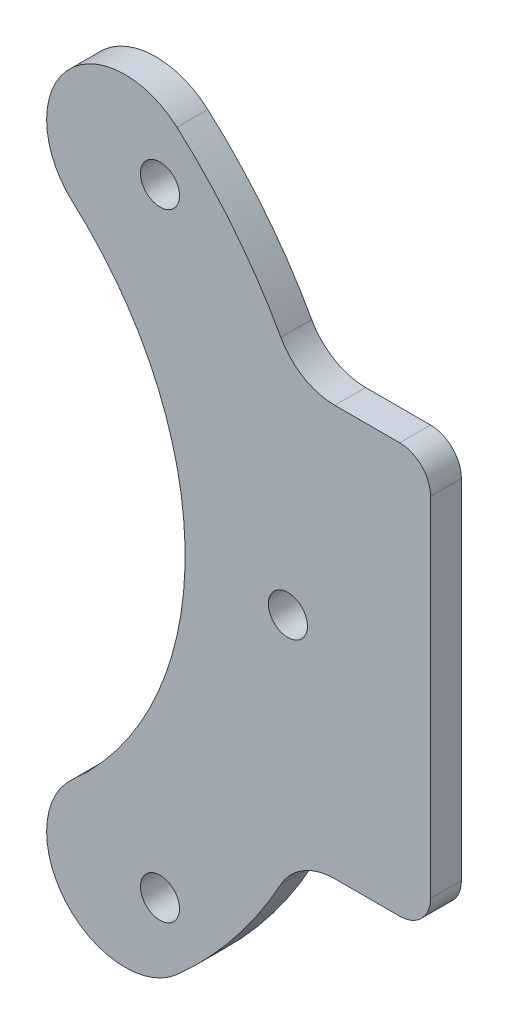
ISO-10303-21;
HEADER;
FILE_DESCRIPTION(('STEP AP214'),'2;1');
FILE_NAME('part.step','',(''),(''),'','','');
FILE_SCHEMA(('AUTOMOTIVE_DESIGN { 1 0 10303 214 1 1 1 1 }'));
ENDSEC;
DATA;
#1=APPLICATION_CONTEXT('core data for automotive mechanical design processes');
#2=APPLICATION_PROTOCOL_DEFINITION('international standard','automotive_design',2000,#1);
#3=PRODUCT_CONTEXT('',#1,'mechanical');
#4=PRODUCT('Part','Part','',(#3));
#5=PRODUCT_RELATED_PRODUCT_CATEGORY('part','',(#4));
#6=PRODUCT_DEFINITION_FORMATION('','',#4);
#7=PRODUCT_DEFINITION_CONTEXT('part definition',#1,'design');
#8=PRODUCT_DEFINITION('design','',#6,#7);
#9=PRODUCT_DEFINITION_SHAPE('','',#8);
#10=(LENGTH_UNIT() NAMED_UNIT(*) SI_UNIT(.MILLI.,.METRE.));
#11=(NAMED_UNIT(*) PLANE_ANGLE_UNIT() SI_UNIT($,.RADIAN.));
#12=(NAMED_UNIT(*) SI_UNIT($,.STERADIAN.) SOLID_ANGLE_UNIT());
#13=UNCERTAINTY_MEASURE_WITH_UNIT(LENGTH_MEASURE(1.E-05),#10,'distance_accuracy_value','');
#14=(GEOMETRIC_REPRESENTATION_CONTEXT(3) GLOBAL_UNCERTAINTY_ASSIGNED_CONTEXT((#13)) GLOBAL_UNIT_ASSIGNED_CONTEXT((#10,
#11,#12)) REPRESENTATION_CONTEXT('',''));
#15=CARTESIAN_POINT('',(0.,0.,0.));
#16=DIRECTION('',(0.,0.,1.));
#17=DIRECTION('',(1.,0.,0.));
#18=AXIS2_PLACEMENT_3D('',#15,#16,#17);
#19=CARTESIAN_POINT('',(0.,0.,3.));
#20=DIRECTION('',(0.,0.,-1.));
#21=DIRECTION('',(-1.,0.,0.));
#22=AXIS2_PLACEMENT_3D('',#19,#20,#21);
#23=CYLINDRICAL_SURFACE('',#22,47.75);
#24=CARTESIAN_POINT('',(0.,0.,3.));
#25=DIRECTION('',(0.,0.,1.));
#26=DIRECTION('',(1.,0.,0.));
#27=AXIS2_PLACEMENT_3D('',#24,#25,#26);
#28=CIRCLE('',#27,47.75);
#29=CARTESIAN_POINT('',(41.8163831096906,23.0532558139535,3.));
#30=VERTEX_POINT('',#29);
#31=CARTESIAN_POINT('',(31.7097109755765,35.7009345794392,3.));
#32=VERTEX_POINT('',#31);
#33=EDGE_CURVE('E159',#30,#32,#28,.T.);
#34=ORIENTED_EDGE('',*,*,#33,.F.);
#35=DIRECTION('',(0.,0.,-1.));
#36=VECTOR('',#35,1.);
#37=CARTESIAN_POINT('',(41.8163831096906,23.0532558139535,3.));
#38=LINE('',#37,#36);
#39=CARTESIAN_POINT('',(41.8163831096906,23.0532558139535,0.));
#40=VERTEX_POINT('',#39);
#41=EDGE_CURVE('E189',#30,#40,#38,.T.);
#42=ORIENTED_EDGE('',*,*,#41,.T.);
#43=CARTESIAN_POINT('',(0.,0.,0.));
#44=DIRECTION('',(0.,0.,1.));
#45=DIRECTION('',(1.,0.,0.));
#46=AXIS2_PLACEMENT_3D('',#43,#44,#45);
#47=CIRCLE('',#46,47.75);
#48=CARTESIAN_POINT('',(31.7097109755765,35.7009345794392,0.));
#49=VERTEX_POINT('',#48);
#50=EDGE_CURVE('E168',#40,#49,#47,.T.);
#51=ORIENTED_EDGE('',*,*,#50,.T.);
#52=DIRECTION('',(0.,0.,-1.));
#53=VECTOR('',#52,1.);
#54=CARTESIAN_POINT('',(31.7097109755765,35.7009345794392,3.));
#55=LINE('',#54,#53);
#56=EDGE_CURVE('E139',#32,#49,#55,.T.);
#57=ORIENTED_EDGE('',*,*,#56,.F.);
#58=EDGE_LOOP('',(#34,#42,#51,#57));
#59=FACE_BOUND('',#58,.T.);
#60=ADVANCED_FACE('F40',(#59),#23,.T.);
#61=CARTESIAN_POINT('',(0.,0.,3.));
#62=DIRECTION('',(0.,0.,1.));
#63=DIRECTION('',(1.,0.,0.));
#64=AXIS2_PLACEMENT_3D('',#61,#62,#63);
#65=PLANE('',#64);
#66=CARTESIAN_POINT('',(30.0520382004281,-30.0520382004284,3.));
#67=DIRECTION('',(0.,0.,1.));
#68=DIRECTION('',(1.,0.,0.));
#69=AXIS2_PLACEMENT_3D('',#66,#67,#68);
#70=CIRCLE('',#69,1.9);
#71=CARTESIAN_POINT('',(31.9520382004281,-30.0520382004284,3.));
#72=VERTEX_POINT('',#71);
#73=EDGE_CURVE('E232',#72,#72,#70,.T.);
#74=ORIENTED_EDGE('',*,*,#73,.F.);
#75=EDGE_LOOP('',(#74));
#76=FACE_BOUND('',#75,.T.);
#77=CARTESIAN_POINT('',(30.0520382004283,30.0520382004282,3.));
#78=DIRECTION('',(0.,0.,1.));
#79=DIRECTION('',(1.,0.,0.));
#80=AXIS2_PLACEMENT_3D('',#77,#78,#79);
#81=CIRCLE('',#80,1.90000000000001);
#82=CARTESIAN_POINT('',(31.9520382004283,30.0520382004282,3.));
#83=VERTEX_POINT('',#82);
#84=EDGE_CURVE('E244',#83,#83,#81,.T.);
#85=ORIENTED_EDGE('',*,*,#84,.F.);
#86=EDGE_LOOP('',(#85));
#87=FACE_BOUND('',#86,.T.);
#88=CARTESIAN_POINT('',(42.5,-1.48387956900833E-13,3.));
#89=DIRECTION('',(0.,0.,1.));
#90=DIRECTION('',(1.,0.,0.));
#91=AXIS2_PLACEMENT_3D('',#88,#89,#90);
#92=CIRCLE('',#91,1.9);
#93=CARTESIAN_POINT('',(44.4,-1.48387956900833E-13,3.));
#94=VERTEX_POINT('',#93);
#95=EDGE_CURVE('E238',#94,#94,#92,.T.);
#96=ORIENTED_EDGE('',*,*,#95,.F.);
#97=EDGE_LOOP('',(#96));
#98=FACE_BOUND('',#97,.T.);
#99=DIRECTION('',(-1.,0.,0.));
#100=VECTOR('',#99,1.);
#101=CARTESIAN_POINT('',(0.,-19.95,3.));
#102=LINE('',#101,#100);
#103=CARTESIAN_POINT('',(53.3827154521245,-19.95,3.));
#104=VERTEX_POINT('',#103);
#105=CARTESIAN_POINT('',(47.0707977412748,-19.95,3.));
#106=VERTEX_POINT('',#105);
#107=EDGE_CURVE('E197',#104,#106,#102,.T.);
#108=ORIENTED_EDGE('',*,*,#107,.F.);
#109=CARTESIAN_POINT('',(53.3827154521245,-16.95,3.));
#110=DIRECTION('',(0.,0.,1.));
#111=DIRECTION('',(1.,0.,0.));
#112=AXIS2_PLACEMENT_3D('',#109,#110,#111);
#113=CIRCLE('',#112,3.);
#114=CARTESIAN_POINT('',(56.3827154521245,-16.95,3.));
#115=VERTEX_POINT('',#114);
#116=EDGE_CURVE('E180',#104,#115,#113,.T.);
#117=ORIENTED_EDGE('',*,*,#116,.T.);
#118=DIRECTION('',(0.,-1.,0.));
#119=VECTOR('',#118,1.);
#120=CARTESIAN_POINT('',(56.3827154521245,0.,3.));
#121=LINE('',#120,#119);
#122=CARTESIAN_POINT('',(56.3827154521245,16.95,3.));
#123=VERTEX_POINT('',#122);
#124=EDGE_CURVE('E207',#123,#115,#121,.T.);
#125=ORIENTED_EDGE('',*,*,#124,.F.);
#126=CARTESIAN_POINT('',(53.3827154521245,16.95,3.));
#127=DIRECTION('',(0.,0.,1.));
#128=DIRECTION('',(1.,0.,0.));
#129=AXIS2_PLACEMENT_3D('',#126,#127,#128);
#130=CIRCLE('',#129,3.);
#131=CARTESIAN_POINT('',(53.3827154521245,19.95,3.));
#132=VERTEX_POINT('',#131);
#133=EDGE_CURVE('E178',#123,#132,#130,.T.);
#134=ORIENTED_EDGE('',*,*,#133,.T.);
#135=DIRECTION('',(-1.,0.,0.));
#136=VECTOR('',#135,1.);
#137=CARTESIAN_POINT('',(0.,19.95,3.));
#138=LINE('',#137,#136);
#139=CARTESIAN_POINT('',(47.0707977412748,19.95,3.));
#140=VERTEX_POINT('',#139);
#141=EDGE_CURVE('E206',#132,#140,#138,.T.);
#142=ORIENTED_EDGE('',*,*,#141,.T.);
#143=CARTESIAN_POINT('',(47.0707977412748,25.95,3.));
#144=DIRECTION('',(0.,0.,1.));
#145=DIRECTION('',(1.,0.,0.));
#146=AXIS2_PLACEMENT_3D('',#143,#144,#145);
#147=CIRCLE('',#146,6.);
#148=EDGE_CURVE('E11',#140,#30,#147,.F.);
#149=ORIENTED_EDGE('',*,*,#148,.T.);
#150=ORIENTED_EDGE('',*,*,#33,.T.);
#151=CARTESIAN_POINT('',(26.6461183852358,30.,3.));
#152=DIRECTION('',(0.,0.,-1.));
#153=DIRECTION('',(-1.,0.,0.));
#154=AXIS2_PLACEMENT_3D('',#151,#152,#153);
#155=CIRCLE('',#154,7.625);
#156=CARTESIAN_POINT('',(21.582525794895,24.2990654205607,3.));
#157=VERTEX_POINT('',#156);
#158=EDGE_CURVE('E152',#157,#32,#155,.T.);
#159=ORIENTED_EDGE('',*,*,#158,.F.);
#160=CARTESIAN_POINT('',(0.,0.,3.));
#161=DIRECTION('',(0.,0.,1.));
#162=DIRECTION('',(1.,0.,0.));
#163=AXIS2_PLACEMENT_3D('',#160,#161,#162);
#164=CIRCLE('',#163,32.5);
#165=CARTESIAN_POINT('',(21.582525794895,-24.2990654205607,3.));
#166=VERTEX_POINT('',#165);
#167=EDGE_CURVE('E151',#166,#157,#164,.T.);
#168=ORIENTED_EDGE('',*,*,#167,.F.);
#169=CARTESIAN_POINT('',(26.6461183852358,-30.,3.));
#170=DIRECTION('',(0.,0.,-1.));
#171=DIRECTION('',(-1.,0.,0.));
#172=AXIS2_PLACEMENT_3D('',#169,#170,#171);
#173=CIRCLE('',#172,7.625);
#174=CARTESIAN_POINT('',(31.7097109755765,-35.7009345794392,3.));
#175=VERTEX_POINT('',#174);
#176=EDGE_CURVE('E131',#175,#166,#173,.T.);
#177=ORIENTED_EDGE('',*,*,#176,.F.);
#178=CARTESIAN_POINT('',(41.8163831096906,-23.0532558139535,3.));
#179=VERTEX_POINT('',#178);
#180=EDGE_CURVE('E147',#175,#179,#28,.T.);
#181=ORIENTED_EDGE('',*,*,#180,.T.);
#182=CARTESIAN_POINT('',(47.0707977412748,-25.95,3.));
#183=DIRECTION('',(0.,0.,1.));
#184=DIRECTION('',(1.,0.,0.));
#185=AXIS2_PLACEMENT_3D('',#182,#183,#184);
#186=CIRCLE('',#185,6.);
#187=EDGE_CURVE('E195',#179,#106,#186,.F.);
#188=ORIENTED_EDGE('',*,*,#187,.T.);
#189=EDGE_LOOP('',(#108,#117,#125,#134,#142,#149,#150,#159,#168,#177,#181,#188));
#190=FACE_BOUND('',#189,.T.);
#191=ADVANCED_FACE('F146',(#76,#87,#98,#190),#65,.T.);
#192=CARTESIAN_POINT('',(0.,0.,0.));
#193=DIRECTION('',(0.,0.,1.));
#194=DIRECTION('',(1.,0.,0.));
#195=AXIS2_PLACEMENT_3D('',#192,#193,#194);
#196=PLANE('',#195);
#197=CARTESIAN_POINT('',(30.0520382004281,-30.0520382004284,0.));
#198=DIRECTION('',(0.,0.,1.));
#199=DIRECTION('',(1.,0.,0.));
#200=AXIS2_PLACEMENT_3D('',#197,#198,#199);
#201=CIRCLE('',#200,1.9);
#202=CARTESIAN_POINT('',(31.9520382004281,-30.0520382004284,0.));
#203=VERTEX_POINT('',#202);
#204=EDGE_CURVE('E228',#203,#203,#201,.T.);
#205=ORIENTED_EDGE('',*,*,#204,.T.);
#206=EDGE_LOOP('',(#205));
#207=FACE_BOUND('',#206,.T.);
#208=CARTESIAN_POINT('',(42.5,-1.48387956900833E-13,0.));
#209=DIRECTION('',(0.,0.,1.));
#210=DIRECTION('',(1.,0.,0.));
#211=AXIS2_PLACEMENT_3D('',#208,#209,#210);
#212=CIRCLE('',#211,1.9);
#213=CARTESIAN_POINT('',(44.4,-1.48387956900833E-13,0.));
#214=VERTEX_POINT('',#213);
#215=EDGE_CURVE('E235',#214,#214,#212,.T.);
#216=ORIENTED_EDGE('',*,*,#215,.T.);
#217=EDGE_LOOP('',(#216));
#218=FACE_BOUND('',#217,.T.);
#219=CARTESIAN_POINT('',(30.0520382004283,30.0520382004282,0.));
#220=DIRECTION('',(0.,0.,1.));
#221=DIRECTION('',(1.,0.,0.));
#222=AXIS2_PLACEMENT_3D('',#219,#220,#221);
#223=CIRCLE('',#222,1.90000000000001);
#224=CARTESIAN_POINT('',(31.9520382004283,30.0520382004282,0.));
#225=VERTEX_POINT('',#224);
#226=EDGE_CURVE('E241',#225,#225,#223,.T.);
#227=ORIENTED_EDGE('',*,*,#226,.T.);
#228=EDGE_LOOP('',(#227));
#229=FACE_BOUND('',#228,.T.);
#230=DIRECTION('',(0.,-1.,0.));
#231=VECTOR('',#230,1.);
#232=CARTESIAN_POINT('',(56.3827154521245,0.,0.));
#233=LINE('',#232,#231);
#234=CARTESIAN_POINT('',(56.3827154521245,16.95,0.));
#235=VERTEX_POINT('',#234);
#236=CARTESIAN_POINT('',(56.3827154521245,-16.95,0.));
#237=VERTEX_POINT('',#236);
#238=EDGE_CURVE('E214',#235,#237,#233,.T.);
#239=ORIENTED_EDGE('',*,*,#238,.T.);
#240=CARTESIAN_POINT('',(53.3827154521245,-16.95,0.));
#241=DIRECTION('',(0.,0.,1.));
#242=DIRECTION('',(1.,0.,0.));
#243=AXIS2_PLACEMENT_3D('',#240,#241,#242);
#244=CIRCLE('',#243,3.);
#245=CARTESIAN_POINT('',(53.3827154521245,-19.95,0.));
#246=VERTEX_POINT('',#245);
#247=EDGE_CURVE('E174',#237,#246,#244,.F.);
#248=ORIENTED_EDGE('',*,*,#247,.T.);
#249=DIRECTION('',(-1.,0.,0.));
#250=VECTOR('',#249,1.);
#251=CARTESIAN_POINT('',(0.,-19.95,0.));
#252=LINE('',#251,#250);
#253=CARTESIAN_POINT('',(47.0707977412748,-19.95,0.));
#254=VERTEX_POINT('',#253);
#255=EDGE_CURVE('E212',#246,#254,#252,.T.);
#256=ORIENTED_EDGE('',*,*,#255,.T.);
#257=CARTESIAN_POINT('',(47.0707977412748,-25.95,0.));
#258=DIRECTION('',(0.,0.,1.));
#259=DIRECTION('',(1.,0.,0.));
#260=AXIS2_PLACEMENT_3D('',#257,#258,#259);
#261=CIRCLE('',#260,6.);
#262=CARTESIAN_POINT('',(41.8163831096906,-23.0532558139535,0.));
#263=VERTEX_POINT('',#262);
#264=EDGE_CURVE('E193',#254,#263,#261,.T.);
#265=ORIENTED_EDGE('',*,*,#264,.T.);
#266=CARTESIAN_POINT('',(31.7097109755765,-35.7009345794392,0.));
#267=VERTEX_POINT('',#266);
#268=EDGE_CURVE('E163',#267,#263,#47,.T.);
#269=ORIENTED_EDGE('',*,*,#268,.F.);
#270=CARTESIAN_POINT('',(26.6461183852358,-30.,0.));
#271=DIRECTION('',(0.,0.,-1.));
#272=DIRECTION('',(-1.,0.,0.));
#273=AXIS2_PLACEMENT_3D('',#270,#271,#272);
#274=CIRCLE('',#273,7.625);
#275=CARTESIAN_POINT('',(21.582525794895,-24.2990654205607,0.));
#276=VERTEX_POINT('',#275);
#277=EDGE_CURVE('E134',#267,#276,#274,.T.);
#278=ORIENTED_EDGE('',*,*,#277,.T.);
#279=CARTESIAN_POINT('',(0.,0.,0.));
#280=DIRECTION('',(0.,0.,1.));
#281=DIRECTION('',(1.,0.,0.));
#282=AXIS2_PLACEMENT_3D('',#279,#280,#281);
#283=CIRCLE('',#282,32.5);
#284=CARTESIAN_POINT('',(21.582525794895,24.2990654205607,0.));
#285=VERTEX_POINT('',#284);
#286=EDGE_CURVE('E166',#276,#285,#283,.T.);
#287=ORIENTED_EDGE('',*,*,#286,.T.);
#288=CARTESIAN_POINT('',(26.6461183852358,30.,0.));
#289=DIRECTION('',(0.,0.,-1.));
#290=DIRECTION('',(-1.,0.,0.));
#291=AXIS2_PLACEMENT_3D('',#288,#289,#290);
#292=CIRCLE('',#291,7.625);
#293=EDGE_CURVE('E153',#285,#49,#292,.T.);
#294=ORIENTED_EDGE('',*,*,#293,.T.);
#295=ORIENTED_EDGE('',*,*,#50,.F.);
#296=CARTESIAN_POINT('',(47.0707977412748,25.95,0.));
#297=DIRECTION('',(0.,0.,1.));
#298=DIRECTION('',(1.,0.,0.));
#299=AXIS2_PLACEMENT_3D('',#296,#297,#298);
#300=CIRCLE('',#299,6.);
#301=CARTESIAN_POINT('',(47.0707977412748,19.95,0.));
#302=VERTEX_POINT('',#301);
#303=EDGE_CURVE('E48',#40,#302,#300,.T.);
#304=ORIENTED_EDGE('',*,*,#303,.T.);
#305=DIRECTION('',(-1.,0.,0.));
#306=VECTOR('',#305,1.);
#307=CARTESIAN_POINT('',(0.,19.95,0.));
#308=LINE('',#307,#306);
#309=CARTESIAN_POINT('',(53.3827154521245,19.95,0.));
#310=VERTEX_POINT('',#309);
#311=EDGE_CURVE('E213',#310,#302,#308,.T.);
#312=ORIENTED_EDGE('',*,*,#311,.F.);
#313=CARTESIAN_POINT('',(53.3827154521245,16.95,0.));
#314=DIRECTION('',(0.,0.,1.));
#315=DIRECTION('',(1.,0.,0.));
#316=AXIS2_PLACEMENT_3D('',#313,#314,#315);
#317=CIRCLE('',#316,3.);
#318=EDGE_CURVE('E172',#310,#235,#317,.F.);
#319=ORIENTED_EDGE('',*,*,#318,.T.);
#320=EDGE_LOOP('',(#239,#248,#256,#265,#269,#278,#287,#294,#295,#304,#312,#319));
#321=FACE_BOUND('',#320,.T.);
#322=ADVANCED_FACE('F211',(#207,#218,#229,#321),#196,.F.);
#323=ORIENTED_EDGE('',*,*,#268,.T.);
#324=DIRECTION('',(0.,0.,-1.));
#325=VECTOR('',#324,1.);
#326=CARTESIAN_POINT('',(41.8163831096906,-23.0532558139535,3.));
#327=LINE('',#326,#325);
#328=EDGE_CURVE('E157',#263,#179,#327,.F.);
#329=ORIENTED_EDGE('',*,*,#328,.T.);
#330=ORIENTED_EDGE('',*,*,#180,.F.);
#331=DIRECTION('',(0.,0.,-1.));
#332=VECTOR('',#331,1.);
#333=CARTESIAN_POINT('',(31.7097109755765,-35.7009345794392,3.));
#334=LINE('',#333,#332);
#335=EDGE_CURVE('E128',#175,#267,#334,.T.);
#336=ORIENTED_EDGE('',*,*,#335,.T.);
#337=EDGE_LOOP('',(#323,#329,#330,#336));
#338=FACE_BOUND('',#337,.T.);
#339=ADVANCED_FACE('F155',(#338),#23,.T.);
#340=CARTESIAN_POINT('',(0.,0.,3.));
#341=DIRECTION('',(0.,0.,-1.));
#342=DIRECTION('',(-1.,0.,0.));
#343=AXIS2_PLACEMENT_3D('',#340,#341,#342);
#344=CYLINDRICAL_SURFACE('',#343,32.5);
#345=ORIENTED_EDGE('',*,*,#167,.T.);
#346=DIRECTION('',(0.,0.,-1.));
#347=VECTOR('',#346,1.);
#348=CARTESIAN_POINT('',(21.582525794895,24.2990654205607,3.));
#349=LINE('',#348,#347);
#350=EDGE_CURVE('E225',#157,#285,#349,.T.);
#351=ORIENTED_EDGE('',*,*,#350,.T.);
#352=ORIENTED_EDGE('',*,*,#286,.F.);
#353=DIRECTION('',(0.,0.,-1.));
#354=VECTOR('',#353,1.);
#355=CARTESIAN_POINT('',(21.582525794895,-24.2990654205607,3.));
#356=LINE('',#355,#354);
#357=EDGE_CURVE('E140',#166,#276,#356,.T.);
#358=ORIENTED_EDGE('',*,*,#357,.F.);
#359=EDGE_LOOP('',(#345,#351,#352,#358));
#360=FACE_BOUND('',#359,.T.);
#361=ADVANCED_FACE('F251',(#360),#344,.F.);
#362=CARTESIAN_POINT('',(30.0520382004283,30.0520382004282,3.));
#363=DIRECTION('',(0.,0.,-1.));
#364=DIRECTION('',(-1.,0.,0.));
#365=AXIS2_PLACEMENT_3D('',#362,#363,#364);
#366=CYLINDRICAL_SURFACE('',#365,1.90000000000001);
#367=ORIENTED_EDGE('',*,*,#84,.T.);
#368=EDGE_LOOP('',(#367));
#369=FACE_BOUND('',#368,.T.);
#370=ORIENTED_EDGE('',*,*,#226,.F.);
#371=EDGE_LOOP('',(#370));
#372=FACE_BOUND('',#371,.T.);
#373=ADVANCED_FACE('F279',(#369,#372),#366,.F.);
#374=CARTESIAN_POINT('',(42.5,-1.48387956900833E-13,3.));
#375=DIRECTION('',(0.,0.,-1.));
#376=DIRECTION('',(-1.,0.,0.));
#377=AXIS2_PLACEMENT_3D('',#374,#375,#376);
#378=CYLINDRICAL_SURFACE('',#377,1.9);
#379=ORIENTED_EDGE('',*,*,#95,.T.);
#380=EDGE_LOOP('',(#379));
#381=FACE_BOUND('',#380,.T.);
#382=ORIENTED_EDGE('',*,*,#215,.F.);
#383=EDGE_LOOP('',(#382));
#384=FACE_BOUND('',#383,.T.);
#385=ADVANCED_FACE('F288',(#381,#384),#378,.F.);
#386=CARTESIAN_POINT('',(30.0520382004281,-30.0520382004284,3.));
#387=DIRECTION('',(0.,0.,-1.));
#388=DIRECTION('',(-1.,0.,0.));
#389=AXIS2_PLACEMENT_3D('',#386,#387,#388);
#390=CYLINDRICAL_SURFACE('',#389,1.9);
#391=ORIENTED_EDGE('',*,*,#73,.T.);
#392=EDGE_LOOP('',(#391));
#393=FACE_BOUND('',#392,.T.);
#394=ORIENTED_EDGE('',*,*,#204,.F.);
#395=EDGE_LOOP('',(#394));
#396=FACE_BOUND('',#395,.T.);
#397=ADVANCED_FACE('F292',(#393,#396),#390,.F.);
#398=CARTESIAN_POINT('',(26.6461183852358,-30.,3.));
#399=DIRECTION('',(0.,0.,-1.));
#400=DIRECTION('',(-1.,0.,0.));
#401=AXIS2_PLACEMENT_3D('',#398,#399,#400);
#402=CYLINDRICAL_SURFACE('',#401,7.625);
#403=ORIENTED_EDGE('',*,*,#277,.F.);
#404=ORIENTED_EDGE('',*,*,#335,.F.);
#405=ORIENTED_EDGE('',*,*,#176,.T.);
#406=ORIENTED_EDGE('',*,*,#357,.T.);
#407=EDGE_LOOP('',(#403,#404,#405,#406));
#408=FACE_BOUND('',#407,.T.);
#409=ADVANCED_FACE('F130',(#408),#402,.T.);
#410=CARTESIAN_POINT('',(26.6461183852358,30.,3.));
#411=DIRECTION('',(0.,0.,-1.));
#412=DIRECTION('',(-1.,0.,0.));
#413=AXIS2_PLACEMENT_3D('',#410,#411,#412);
#414=CYLINDRICAL_SURFACE('',#413,7.625);
#415=ORIENTED_EDGE('',*,*,#293,.F.);
#416=ORIENTED_EDGE('',*,*,#350,.F.);
#417=ORIENTED_EDGE('',*,*,#158,.T.);
#418=ORIENTED_EDGE('',*,*,#56,.T.);
#419=EDGE_LOOP('',(#415,#416,#417,#418));
#420=FACE_BOUND('',#419,.T.);
#421=ADVANCED_FACE('F253',(#420),#414,.T.);
#422=CARTESIAN_POINT('',(56.3827154521245,0.,3.));
#423=DIRECTION('',(1.,0.,0.));
#424=DIRECTION('',(0.,1.,0.));
#425=AXIS2_PLACEMENT_3D('',#422,#423,#424);
#426=PLANE('',#425);
#427=ORIENTED_EDGE('',*,*,#124,.T.);
#428=DIRECTION('',(0.,0.,-1.));
#429=VECTOR('',#428,1.);
#430=CARTESIAN_POINT('',(56.3827154521245,-16.95,3.));
#431=LINE('',#430,#429);
#432=EDGE_CURVE('E161',#115,#237,#431,.T.);
#433=ORIENTED_EDGE('',*,*,#432,.T.);
#434=ORIENTED_EDGE('',*,*,#238,.F.);
#435=DIRECTION('',(0.,0.,-1.));
#436=VECTOR('',#435,1.);
#437=CARTESIAN_POINT('',(56.3827154521245,16.95,3.));
#438=LINE('',#437,#436);
#439=EDGE_CURVE('E158',#235,#123,#438,.F.);
#440=ORIENTED_EDGE('',*,*,#439,.T.);
#441=EDGE_LOOP('',(#427,#433,#434,#440));
#442=FACE_BOUND('',#441,.T.);
#443=ADVANCED_FACE('F301',(#442),#426,.T.);
#444=CARTESIAN_POINT('',(0.,19.95,3.));
#445=DIRECTION('',(0.,-1.,0.));
#446=DIRECTION('',(0.,0.,-1.));
#447=AXIS2_PLACEMENT_3D('',#444,#445,#446);
#448=PLANE('',#447);
#449=ORIENTED_EDGE('',*,*,#311,.T.);
#450=DIRECTION('',(0.,0.,1.));
#451=VECTOR('',#450,1.);
#452=CARTESIAN_POINT('',(47.0707977412748,19.95,3.));
#453=LINE('',#452,#451);
#454=EDGE_CURVE('E61',#302,#140,#453,.T.);
#455=ORIENTED_EDGE('',*,*,#454,.T.);
#456=ORIENTED_EDGE('',*,*,#141,.F.);
#457=DIRECTION('',(0.,0.,-1.));
#458=VECTOR('',#457,1.);
#459=CARTESIAN_POINT('',(53.3827154521245,19.95,0.));
#460=LINE('',#459,#458);
#461=EDGE_CURVE('E182',#132,#310,#460,.T.);
#462=ORIENTED_EDGE('',*,*,#461,.T.);
#463=EDGE_LOOP('',(#449,#455,#456,#462));
#464=FACE_BOUND('',#463,.T.);
#465=ADVANCED_FACE('F304',(#464),#448,.F.);
#466=CARTESIAN_POINT('',(0.,-19.95,3.));
#467=DIRECTION('',(0.,-1.,0.));
#468=DIRECTION('',(0.,0.,-1.));
#469=AXIS2_PLACEMENT_3D('',#466,#467,#468);
#470=PLANE('',#469);
#471=ORIENTED_EDGE('',*,*,#107,.T.);
#472=DIRECTION('',(0.,0.,-1.));
#473=VECTOR('',#472,1.);
#474=CARTESIAN_POINT('',(47.0707977412748,-19.95,3.));
#475=LINE('',#474,#473);
#476=EDGE_CURVE('E185',#106,#254,#475,.T.);
#477=ORIENTED_EDGE('',*,*,#476,.T.);
#478=ORIENTED_EDGE('',*,*,#255,.F.);
#479=DIRECTION('',(0.,0.,-1.));
#480=VECTOR('',#479,1.);
#481=CARTESIAN_POINT('',(53.3827154521245,-19.95,3.));
#482=LINE('',#481,#480);
#483=EDGE_CURVE('E176',#246,#104,#482,.F.);
#484=ORIENTED_EDGE('',*,*,#483,.T.);
#485=EDGE_LOOP('',(#471,#477,#478,#484));
#486=FACE_BOUND('',#485,.T.);
#487=ADVANCED_FACE('F202',(#486),#470,.T.);
#488=CARTESIAN_POINT('',(53.3827154521245,-16.95,3.));
#489=DIRECTION('',(0.,0.,-1.));
#490=DIRECTION('',(-1.,0.,0.));
#491=AXIS2_PLACEMENT_3D('',#488,#489,#490);
#492=CYLINDRICAL_SURFACE('',#491,3.);
#493=ORIENTED_EDGE('',*,*,#116,.F.);
#494=ORIENTED_EDGE('',*,*,#483,.F.);
#495=ORIENTED_EDGE('',*,*,#247,.F.);
#496=ORIENTED_EDGE('',*,*,#432,.F.);
#497=EDGE_LOOP('',(#493,#494,#495,#496));
#498=FACE_BOUND('',#497,.T.);
#499=ADVANCED_FACE('F308',(#498),#492,.T.);
#500=CARTESIAN_POINT('',(53.3827154521245,16.95,3.));
#501=DIRECTION('',(0.,0.,1.));
#502=DIRECTION('',(1.,0.,0.));
#503=AXIS2_PLACEMENT_3D('',#500,#501,#502);
#504=CYLINDRICAL_SURFACE('',#503,3.);
#505=ORIENTED_EDGE('',*,*,#133,.F.);
#506=ORIENTED_EDGE('',*,*,#439,.F.);
#507=ORIENTED_EDGE('',*,*,#318,.F.);
#508=ORIENTED_EDGE('',*,*,#461,.F.);
#509=EDGE_LOOP('',(#505,#506,#507,#508));
#510=FACE_BOUND('',#509,.T.);
#511=ADVANCED_FACE('F264',(#510),#504,.T.);
#512=CARTESIAN_POINT('',(47.0707977412748,-25.95,3.));
#513=DIRECTION('',(0.,0.,-1.));
#514=DIRECTION('',(-1.,0.,0.));
#515=AXIS2_PLACEMENT_3D('',#512,#513,#514);
#516=CYLINDRICAL_SURFACE('',#515,6.);
#517=ORIENTED_EDGE('',*,*,#187,.F.);
#518=ORIENTED_EDGE('',*,*,#328,.F.);
#519=ORIENTED_EDGE('',*,*,#264,.F.);
#520=ORIENTED_EDGE('',*,*,#476,.F.);
#521=EDGE_LOOP('',(#517,#518,#519,#520));
#522=FACE_BOUND('',#521,.T.);
#523=ADVANCED_FACE('F209',(#522),#516,.F.);
#524=CARTESIAN_POINT('',(47.0707977412748,25.95,3.));
#525=DIRECTION('',(0.,0.,-1.));
#526=DIRECTION('',(-1.,0.,0.));
#527=AXIS2_PLACEMENT_3D('',#524,#525,#526);
#528=CYLINDRICAL_SURFACE('',#527,6.);
#529=ORIENTED_EDGE('',*,*,#148,.F.);
#530=ORIENTED_EDGE('',*,*,#454,.F.);
#531=ORIENTED_EDGE('',*,*,#303,.F.);
#532=ORIENTED_EDGE('',*,*,#41,.F.);
#533=EDGE_LOOP('',(#529,#530,#531,#532));
#534=FACE_BOUND('',#533,.T.);
#535=ADVANCED_FACE('F42',(#534),#528,.F.);
#536=CLOSED_SHELL('',(#60,#191,#322,#339,#361,#373,#385,#397,#409,#421,#443,#465,#487,#499,#511,
#523,#535));
#537=MANIFOLD_SOLID_BREP('B2',#536);
#538=ADVANCED_BREP_SHAPE_REPRESENTATION('',(#18,#537),#14);
#539=SHAPE_DEFINITION_REPRESENTATION(#9,#538);
ENDSEC;
END-ISO-10303-21;
